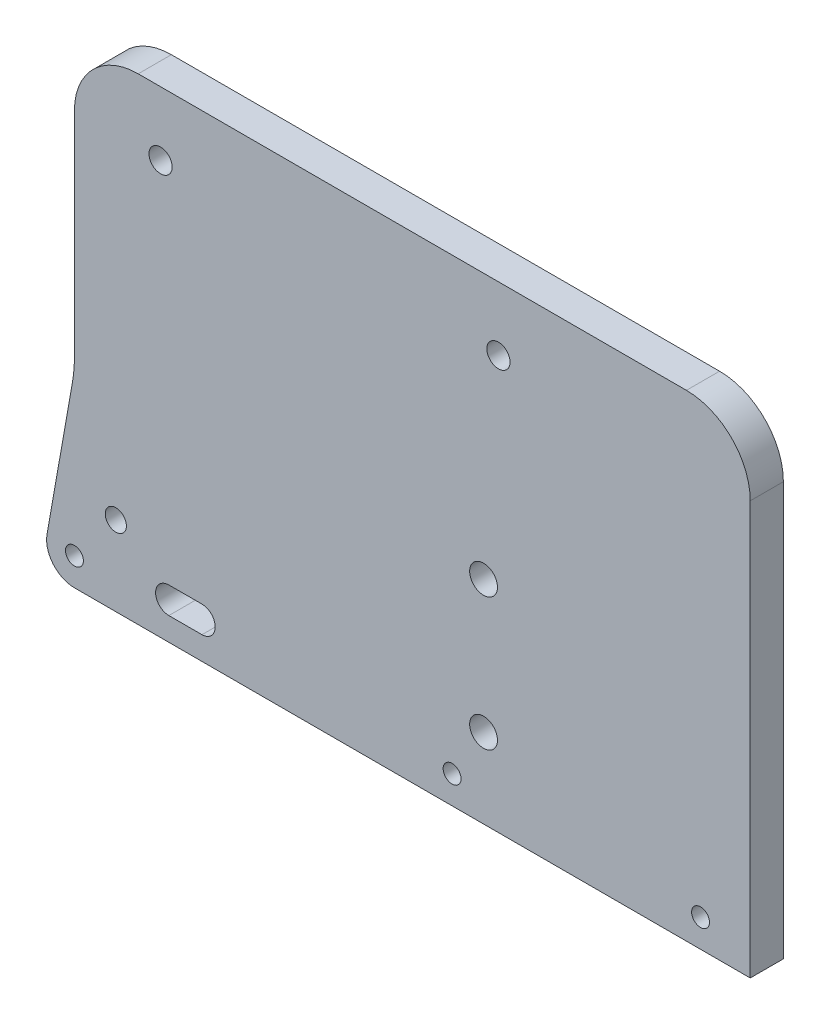
ISO-10303-21;
HEADER;
FILE_DESCRIPTION(('STEP AP214'),'2;1');
FILE_NAME('part.step','',(''),(''),'','','');
FILE_SCHEMA(('AUTOMOTIVE_DESIGN { 1 0 10303 214 1 1 1 1 }'));
ENDSEC;
DATA;
#1=APPLICATION_CONTEXT('core data for automotive mechanical design processes');
#2=APPLICATION_PROTOCOL_DEFINITION('international standard','automotive_design',2000,#1);
#3=PRODUCT_CONTEXT('',#1,'mechanical');
#4=PRODUCT('Part','Part','',(#3));
#5=PRODUCT_RELATED_PRODUCT_CATEGORY('part','',(#4));
#6=PRODUCT_DEFINITION_FORMATION('','',#4);
#7=PRODUCT_DEFINITION_CONTEXT('part definition',#1,'design');
#8=PRODUCT_DEFINITION('design','',#6,#7);
#9=PRODUCT_DEFINITION_SHAPE('','',#8);
#10=(LENGTH_UNIT() NAMED_UNIT(*) SI_UNIT(.MILLI.,.METRE.));
#11=(NAMED_UNIT(*) PLANE_ANGLE_UNIT() SI_UNIT($,.RADIAN.));
#12=(NAMED_UNIT(*) SI_UNIT($,.STERADIAN.) SOLID_ANGLE_UNIT());
#13=UNCERTAINTY_MEASURE_WITH_UNIT(LENGTH_MEASURE(1.E-05),#10,'distance_accuracy_value','');
#14=(GEOMETRIC_REPRESENTATION_CONTEXT(3) GLOBAL_UNCERTAINTY_ASSIGNED_CONTEXT((#13)) GLOBAL_UNIT_ASSIGNED_CONTEXT((#10,
#11,#12)) REPRESENTATION_CONTEXT('',''));
#15=CARTESIAN_POINT('',(0.,0.,0.));
#16=DIRECTION('',(0.,0.,1.));
#17=DIRECTION('',(1.,0.,0.));
#18=AXIS2_PLACEMENT_3D('',#15,#16,#17);
#19=CARTESIAN_POINT('',(30.62,50.37,5.));
#20=DIRECTION('',(0.,0.,1.));
#21=DIRECTION('',(1.,0.,0.));
#22=AXIS2_PLACEMENT_3D('',#19,#20,#21);
#23=PLANE('',#22);
#24=DIRECTION('',(1.,0.,0.));
#25=VECTOR('',#24,1.);
#26=CARTESIAN_POINT('',(-47.5,-8.5,5.));
#27=LINE('',#26,#25);
#28=CARTESIAN_POINT('',(-47.5,-8.5,5.));
#29=VERTEX_POINT('',#28);
#30=CARTESIAN_POINT('',(-42.5,-8.5,5.));
#31=VERTEX_POINT('',#30);
#32=EDGE_CURVE('E142',#29,#31,#27,.T.);
#33=ORIENTED_EDGE('',*,*,#32,.F.);
#34=CARTESIAN_POINT('',(-47.5,-6.5,5.));
#35=DIRECTION('',(0.,0.,1.));
#36=DIRECTION('',(1.,0.,0.));
#37=AXIS2_PLACEMENT_3D('',#34,#35,#36);
#38=CIRCLE('',#37,2.);
#39=CARTESIAN_POINT('',(-47.5,-4.5,5.));
#40=VERTEX_POINT('',#39);
#41=EDGE_CURVE('E134',#40,#29,#38,.T.);
#42=ORIENTED_EDGE('',*,*,#41,.F.);
#43=DIRECTION('',(-1.,0.,0.));
#44=VECTOR('',#43,1.);
#45=CARTESIAN_POINT('',(-47.5,-4.5,5.));
#46=LINE('',#45,#44);
#47=CARTESIAN_POINT('',(-42.5,-4.5,5.));
#48=VERTEX_POINT('',#47);
#49=EDGE_CURVE('E157',#48,#40,#46,.T.);
#50=ORIENTED_EDGE('',*,*,#49,.F.);
#51=CARTESIAN_POINT('',(-42.5,-6.5,5.));
#52=DIRECTION('',(0.,0.,1.));
#53=DIRECTION('',(1.,0.,0.));
#54=AXIS2_PLACEMENT_3D('',#51,#52,#53);
#55=CIRCLE('',#54,2.);
#56=EDGE_CURVE('E155',#31,#48,#55,.T.);
#57=ORIENTED_EDGE('',*,*,#56,.F.);
#58=EDGE_LOOP('',(#33,#42,#50,#57));
#59=FACE_BOUND('',#58,.T.);
#60=CARTESIAN_POINT('',(0.,20.,5.));
#61=DIRECTION('',(0.,0.,1.));
#62=DIRECTION('',(1.,0.,0.));
#63=AXIS2_PLACEMENT_3D('',#60,#61,#62);
#64=CIRCLE('',#63,2.1);
#65=CARTESIAN_POINT('',(2.1,20.,5.));
#66=VERTEX_POINT('',#65);
#67=EDGE_CURVE('E185',#66,#66,#64,.T.);
#68=ORIENTED_EDGE('',*,*,#67,.F.);
#69=EDGE_LOOP('',(#68));
#70=FACE_BOUND('',#69,.T.);
#71=CARTESIAN_POINT('',(-61.75,-7.8,5.));
#72=DIRECTION('',(0.,0.,1.));
#73=DIRECTION('',(1.,0.,0.));
#74=AXIS2_PLACEMENT_3D('',#71,#72,#73);
#75=CIRCLE('',#74,1.35);
#76=CARTESIAN_POINT('',(-60.4,-7.8,5.));
#77=VERTEX_POINT('',#76);
#78=EDGE_CURVE('E204',#77,#77,#75,.T.);
#79=ORIENTED_EDGE('',*,*,#78,.F.);
#80=EDGE_LOOP('',(#79));
#81=FACE_BOUND('',#80,.T.);
#82=CARTESIAN_POINT('',(2.25,50.37,5.));
#83=DIRECTION('',(0.,0.,1.));
#84=DIRECTION('',(-1.,0.,0.));
#85=AXIS2_PLACEMENT_3D('',#82,#83,#84);
#86=CIRCLE('',#85,1.75);
#87=CARTESIAN_POINT('',(0.499999999999995,50.37,5.));
#88=VERTEX_POINT('',#87);
#89=EDGE_CURVE('E220',#88,#88,#86,.T.);
#90=ORIENTED_EDGE('',*,*,#89,.F.);
#91=EDGE_LOOP('',(#90));
#92=FACE_BOUND('',#91,.T.);
#93=CARTESIAN_POINT('',(0.,0.,5.));
#94=DIRECTION('',(0.,0.,1.));
#95=DIRECTION('',(1.,0.,0.));
#96=AXIS2_PLACEMENT_3D('',#93,#94,#95);
#97=CIRCLE('',#96,2.1);
#98=CARTESIAN_POINT('',(2.1,0.,5.));
#99=VERTEX_POINT('',#98);
#100=EDGE_CURVE('E238',#99,#99,#97,.T.);
#101=ORIENTED_EDGE('',*,*,#100,.F.);
#102=EDGE_LOOP('',(#101));
#103=FACE_BOUND('',#102,.T.);
#104=CARTESIAN_POINT('',(30.62,50.37,5.));
#105=DIRECTION('',(0.,0.,1.));
#106=DIRECTION('',(1.,0.,0.));
#107=AXIS2_PLACEMENT_3D('',#104,#105,#106);
#108=CIRCLE('',#107,9.63);
#109=CARTESIAN_POINT('',(40.25,50.37,5.));
#110=VERTEX_POINT('',#109);
#111=CARTESIAN_POINT('',(30.62,60.,5.));
#112=VERTEX_POINT('',#111);
#113=EDGE_CURVE('E246',#110,#112,#108,.T.);
#114=ORIENTED_EDGE('',*,*,#113,.T.);
#115=DIRECTION('',(-1.,0.,0.));
#116=VECTOR('',#115,1.);
#117=CARTESIAN_POINT('',(-52.12,60.,5.));
#118=LINE('',#117,#116);
#119=CARTESIAN_POINT('',(-52.12,60.,5.));
#120=VERTEX_POINT('',#119);
#121=EDGE_CURVE('E388',#112,#120,#118,.T.);
#122=ORIENTED_EDGE('',*,*,#121,.T.);
#123=CARTESIAN_POINT('',(-52.12,50.37,5.));
#124=DIRECTION('',(0.,0.,1.));
#125=DIRECTION('',(1.,0.,0.));
#126=AXIS2_PLACEMENT_3D('',#123,#124,#125);
#127=CIRCLE('',#126,9.63);
#128=CARTESIAN_POINT('',(-61.75,50.37,5.));
#129=VERTEX_POINT('',#128);
#130=EDGE_CURVE('E320',#120,#129,#127,.T.);
#131=ORIENTED_EDGE('',*,*,#130,.T.);
#132=DIRECTION('',(0.,-1.,0.));
#133=VECTOR('',#132,1.);
#134=CARTESIAN_POINT('',(-61.75,18.1366092997226,5.));
#135=LINE('',#134,#133);
#136=CARTESIAN_POINT('',(-61.75,18.1366092997226,5.));
#137=VERTEX_POINT('',#136);
#138=EDGE_CURVE('E409',#129,#137,#135,.T.);
#139=ORIENTED_EDGE('',*,*,#138,.T.);
#140=CARTESIAN_POINT('',(-81.75,18.1366092997226,5.));
#141=DIRECTION('',(0.,0.,-1.));
#142=DIRECTION('',(1.,0.,0.));
#143=AXIS2_PLACEMENT_3D('',#140,#141,#142);
#144=CIRCLE('',#143,20.);
#145=CARTESIAN_POINT('',(-62.0538449397558,14.6636457463841,5.));
#146=VERTEX_POINT('',#145);
#147=EDGE_CURVE('E407',#137,#146,#144,.T.);
#148=ORIENTED_EDGE('',*,*,#147,.T.);
#149=DIRECTION('',(-0.173648177666923,-0.984807753012209,0.));
#150=VECTOR('',#149,1.);
#151=CARTESIAN_POINT('',(-62.0538449397558,14.6636457463841,5.));
#152=LINE('',#151,#150);
#153=CARTESIAN_POINT('',(-65.8861925626513,-7.07067765379892,5.));
#154=VERTEX_POINT('',#153);
#155=EDGE_CURVE('E405',#146,#154,#152,.T.);
#156=ORIENTED_EDGE('',*,*,#155,.T.);
#157=CARTESIAN_POINT('',(-61.75,-7.8,5.));
#158=DIRECTION('',(0.,0.,1.));
#159=DIRECTION('',(1.,0.,0.));
#160=AXIS2_PLACEMENT_3D('',#157,#158,#159);
#161=CIRCLE('',#160,4.2);
#162=CARTESIAN_POINT('',(-61.75,-12.,5.));
#163=VERTEX_POINT('',#162);
#164=EDGE_CURVE('E401',#154,#163,#161,.T.);
#165=ORIENTED_EDGE('',*,*,#164,.T.);
#166=DIRECTION('',(1.,0.,0.));
#167=VECTOR('',#166,1.);
#168=CARTESIAN_POINT('',(-61.75,-12.,5.));
#169=LINE('',#168,#167);
#170=CARTESIAN_POINT('',(40.25,-12.,5.));
#171=VERTEX_POINT('',#170);
#172=EDGE_CURVE('E398',#163,#171,#169,.T.);
#173=ORIENTED_EDGE('',*,*,#172,.T.);
#174=DIRECTION('',(0.,1.,0.));
#175=VECTOR('',#174,1.);
#176=CARTESIAN_POINT('',(40.25,-12.,5.));
#177=LINE('',#176,#175);
#178=EDGE_CURVE('E258',#171,#110,#177,.T.);
#179=ORIENTED_EDGE('',*,*,#178,.T.);
#180=EDGE_LOOP('',(#114,#122,#131,#139,#148,#156,#165,#173,#179));
#181=FACE_BOUND('',#180,.T.);
#182=CARTESIAN_POINT('',(-48.75,50.37,5.));
#183=DIRECTION('',(0.,0.,1.));
#184=DIRECTION('',(1.,0.,0.));
#185=AXIS2_PLACEMENT_3D('',#182,#183,#184);
#186=CIRCLE('',#185,1.75);
#187=CARTESIAN_POINT('',(-47.,50.37,5.));
#188=VERTEX_POINT('',#187);
#189=EDGE_CURVE('E230',#188,#188,#186,.T.);
#190=ORIENTED_EDGE('',*,*,#189,.F.);
#191=EDGE_LOOP('',(#190));
#192=FACE_BOUND('',#191,.T.);
#193=CARTESIAN_POINT('',(32.75,-7.8,5.));
#194=DIRECTION('',(0.,0.,1.));
#195=DIRECTION('',(1.,0.,0.));
#196=AXIS2_PLACEMENT_3D('',#193,#194,#195);
#197=CIRCLE('',#196,1.35);
#198=CARTESIAN_POINT('',(34.1,-7.8,5.));
#199=VERTEX_POINT('',#198);
#200=EDGE_CURVE('E212',#199,#199,#197,.T.);
#201=ORIENTED_EDGE('',*,*,#200,.F.);
#202=EDGE_LOOP('',(#201));
#203=FACE_BOUND('',#202,.T.);
#204=CARTESIAN_POINT('',(-4.75,-7.8,5.));
#205=DIRECTION('',(0.,0.,1.));
#206=DIRECTION('',(1.,0.,0.));
#207=AXIS2_PLACEMENT_3D('',#204,#205,#206);
#208=CIRCLE('',#207,1.35);
#209=CARTESIAN_POINT('',(-3.4,-7.8,5.));
#210=VERTEX_POINT('',#209);
#211=EDGE_CURVE('E193',#210,#210,#208,.T.);
#212=ORIENTED_EDGE('',*,*,#211,.F.);
#213=EDGE_LOOP('',(#212));
#214=FACE_BOUND('',#213,.T.);
#215=CARTESIAN_POINT('',(-55.5,0.,5.));
#216=DIRECTION('',(0.,0.,1.));
#217=DIRECTION('',(1.,0.,0.));
#218=AXIS2_PLACEMENT_3D('',#215,#216,#217);
#219=CIRCLE('',#218,1.6);
#220=CARTESIAN_POINT('',(-53.9,0.,5.));
#221=VERTEX_POINT('',#220);
#222=EDGE_CURVE('E164',#221,#221,#219,.T.);
#223=ORIENTED_EDGE('',*,*,#222,.F.);
#224=EDGE_LOOP('',(#223));
#225=FACE_BOUND('',#224,.T.);
#226=ADVANCED_FACE('F39',(#59,#70,#81,#92,#103,#181,#192,#203,#214,#225),#23,.T.);
#227=CARTESIAN_POINT('',(30.62,50.37,0.));
#228=DIRECTION('',(0.,0.,1.));
#229=DIRECTION('',(1.,0.,0.));
#230=AXIS2_PLACEMENT_3D('',#227,#228,#229);
#231=PLANE('',#230);
#232=CARTESIAN_POINT('',(0.,20.,0.));
#233=DIRECTION('',(0.,0.,1.));
#234=DIRECTION('',(1.,0.,0.));
#235=AXIS2_PLACEMENT_3D('',#232,#233,#234);
#236=CIRCLE('',#235,2.1);
#237=CARTESIAN_POINT('',(2.1,20.,0.));
#238=VERTEX_POINT('',#237);
#239=EDGE_CURVE('E150',#238,#238,#236,.T.);
#240=ORIENTED_EDGE('',*,*,#239,.T.);
#241=EDGE_LOOP('',(#240));
#242=FACE_BOUND('',#241,.T.);
#243=CARTESIAN_POINT('',(-4.75,-7.8,0.));
#244=DIRECTION('',(0.,0.,1.));
#245=DIRECTION('',(1.,0.,0.));
#246=AXIS2_PLACEMENT_3D('',#243,#244,#245);
#247=CIRCLE('',#246,1.35);
#248=CARTESIAN_POINT('',(-3.4,-7.8,0.));
#249=VERTEX_POINT('',#248);
#250=EDGE_CURVE('E188',#249,#249,#247,.T.);
#251=ORIENTED_EDGE('',*,*,#250,.T.);
#252=EDGE_LOOP('',(#251));
#253=FACE_BOUND('',#252,.T.);
#254=CARTESIAN_POINT('',(-61.75,-7.8,0.));
#255=DIRECTION('',(0.,0.,1.));
#256=DIRECTION('',(1.,0.,0.));
#257=AXIS2_PLACEMENT_3D('',#254,#255,#256);
#258=CIRCLE('',#257,1.35);
#259=CARTESIAN_POINT('',(-60.4,-7.8,0.));
#260=VERTEX_POINT('',#259);
#261=EDGE_CURVE('E207',#260,#260,#258,.T.);
#262=ORIENTED_EDGE('',*,*,#261,.T.);
#263=EDGE_LOOP('',(#262));
#264=FACE_BOUND('',#263,.T.);
#265=CARTESIAN_POINT('',(32.75,-7.8,0.));
#266=DIRECTION('',(0.,0.,1.));
#267=DIRECTION('',(1.,0.,0.));
#268=AXIS2_PLACEMENT_3D('',#265,#266,#267);
#269=CIRCLE('',#268,1.35);
#270=CARTESIAN_POINT('',(34.1,-7.8,0.));
#271=VERTEX_POINT('',#270);
#272=EDGE_CURVE('E206',#271,#271,#269,.T.);
#273=ORIENTED_EDGE('',*,*,#272,.T.);
#274=EDGE_LOOP('',(#273));
#275=FACE_BOUND('',#274,.T.);
#276=CARTESIAN_POINT('',(2.25,50.37,0.));
#277=DIRECTION('',(0.,0.,1.));
#278=DIRECTION('',(-1.,0.,0.));
#279=AXIS2_PLACEMENT_3D('',#276,#277,#278);
#280=CIRCLE('',#279,1.75);
#281=CARTESIAN_POINT('',(0.499999999999995,50.37,0.));
#282=VERTEX_POINT('',#281);
#283=EDGE_CURVE('E215',#282,#282,#280,.T.);
#284=ORIENTED_EDGE('',*,*,#283,.T.);
#285=EDGE_LOOP('',(#284));
#286=FACE_BOUND('',#285,.T.);
#287=CARTESIAN_POINT('',(-48.75,50.37,0.));
#288=DIRECTION('',(0.,0.,1.));
#289=DIRECTION('',(1.,0.,0.));
#290=AXIS2_PLACEMENT_3D('',#287,#288,#289);
#291=CIRCLE('',#290,1.75);
#292=CARTESIAN_POINT('',(-47.,50.37,0.));
#293=VERTEX_POINT('',#292);
#294=EDGE_CURVE('E233',#293,#293,#291,.T.);
#295=ORIENTED_EDGE('',*,*,#294,.T.);
#296=EDGE_LOOP('',(#295));
#297=FACE_BOUND('',#296,.T.);
#298=CARTESIAN_POINT('',(0.,0.,0.));
#299=DIRECTION('',(0.,0.,1.));
#300=DIRECTION('',(1.,0.,0.));
#301=AXIS2_PLACEMENT_3D('',#298,#299,#300);
#302=CIRCLE('',#301,2.1);
#303=CARTESIAN_POINT('',(2.1,0.,0.));
#304=VERTEX_POINT('',#303);
#305=EDGE_CURVE('E232',#304,#304,#302,.T.);
#306=ORIENTED_EDGE('',*,*,#305,.T.);
#307=EDGE_LOOP('',(#306));
#308=FACE_BOUND('',#307,.T.);
#309=CARTESIAN_POINT('',(30.62,50.37,0.));
#310=DIRECTION('',(0.,0.,1.));
#311=DIRECTION('',(1.,0.,0.));
#312=AXIS2_PLACEMENT_3D('',#309,#310,#311);
#313=CIRCLE('',#312,9.63);
#314=CARTESIAN_POINT('',(40.25,50.37,0.));
#315=VERTEX_POINT('',#314);
#316=CARTESIAN_POINT('',(30.62,60.,0.));
#317=VERTEX_POINT('',#316);
#318=EDGE_CURVE('E241',#315,#317,#313,.T.);
#319=ORIENTED_EDGE('',*,*,#318,.F.);
#320=DIRECTION('',(0.,1.,0.));
#321=VECTOR('',#320,1.);
#322=CARTESIAN_POINT('',(40.25,-12.,0.));
#323=LINE('',#322,#321);
#324=CARTESIAN_POINT('',(40.25,-12.,0.));
#325=VERTEX_POINT('',#324);
#326=EDGE_CURVE('E289',#325,#315,#323,.T.);
#327=ORIENTED_EDGE('',*,*,#326,.F.);
#328=DIRECTION('',(1.,0.,0.));
#329=VECTOR('',#328,1.);
#330=CARTESIAN_POINT('',(-61.75,-12.,0.));
#331=LINE('',#330,#329);
#332=CARTESIAN_POINT('',(-61.75,-12.,0.));
#333=VERTEX_POINT('',#332);
#334=EDGE_CURVE('E286',#333,#325,#331,.T.);
#335=ORIENTED_EDGE('',*,*,#334,.F.);
#336=CARTESIAN_POINT('',(-61.75,-7.8,0.));
#337=DIRECTION('',(0.,0.,1.));
#338=DIRECTION('',(1.,0.,0.));
#339=AXIS2_PLACEMENT_3D('',#336,#337,#338);
#340=CIRCLE('',#339,4.2);
#341=CARTESIAN_POINT('',(-65.8861925626513,-7.07067765379892,0.));
#342=VERTEX_POINT('',#341);
#343=EDGE_CURVE('E282',#342,#333,#340,.T.);
#344=ORIENTED_EDGE('',*,*,#343,.F.);
#345=DIRECTION('',(-0.173648177666923,-0.984807753012209,0.));
#346=VECTOR('',#345,1.);
#347=CARTESIAN_POINT('',(-62.0538449397558,14.6636457463841,0.));
#348=LINE('',#347,#346);
#349=CARTESIAN_POINT('',(-62.0538449397558,14.6636457463841,0.));
#350=VERTEX_POINT('',#349);
#351=EDGE_CURVE('E278',#350,#342,#348,.T.);
#352=ORIENTED_EDGE('',*,*,#351,.F.);
#353=CARTESIAN_POINT('',(-81.75,18.1366092997226,0.));
#354=DIRECTION('',(0.,0.,-1.));
#355=DIRECTION('',(1.,0.,0.));
#356=AXIS2_PLACEMENT_3D('',#353,#354,#355);
#357=CIRCLE('',#356,20.);
#358=CARTESIAN_POINT('',(-61.75,18.1366092997226,0.));
#359=VERTEX_POINT('',#358);
#360=EDGE_CURVE('E275',#359,#350,#357,.T.);
#361=ORIENTED_EDGE('',*,*,#360,.F.);
#362=DIRECTION('',(0.,-1.,0.));
#363=VECTOR('',#362,1.);
#364=CARTESIAN_POINT('',(-61.75,18.1366092997226,0.));
#365=LINE('',#364,#363);
#366=CARTESIAN_POINT('',(-61.75,50.37,0.));
#367=VERTEX_POINT('',#366);
#368=EDGE_CURVE('E267',#367,#359,#365,.T.);
#369=ORIENTED_EDGE('',*,*,#368,.F.);
#370=CARTESIAN_POINT('',(-52.12,50.37,0.));
#371=DIRECTION('',(0.,0.,1.));
#372=DIRECTION('',(1.,0.,0.));
#373=AXIS2_PLACEMENT_3D('',#370,#371,#372);
#374=CIRCLE('',#373,9.63);
#375=CARTESIAN_POINT('',(-52.12,60.,0.));
#376=VERTEX_POINT('',#375);
#377=EDGE_CURVE('E263',#376,#367,#374,.T.);
#378=ORIENTED_EDGE('',*,*,#377,.F.);
#379=DIRECTION('',(-1.,0.,0.));
#380=VECTOR('',#379,1.);
#381=CARTESIAN_POINT('',(-52.12,60.,0.));
#382=LINE('',#381,#380);
#383=EDGE_CURVE('E257',#317,#376,#382,.T.);
#384=ORIENTED_EDGE('',*,*,#383,.F.);
#385=EDGE_LOOP('',(#319,#327,#335,#344,#352,#361,#369,#378,#384));
#386=FACE_BOUND('',#385,.T.);
#387=CARTESIAN_POINT('',(-47.5,-6.5,0.));
#388=DIRECTION('',(0.,0.,1.));
#389=DIRECTION('',(1.,0.,0.));
#390=AXIS2_PLACEMENT_3D('',#387,#388,#389);
#391=CIRCLE('',#390,2.);
#392=CARTESIAN_POINT('',(-47.5,-4.5,0.));
#393=VERTEX_POINT('',#392);
#394=CARTESIAN_POINT('',(-47.5,-8.5,0.));
#395=VERTEX_POINT('',#394);
#396=EDGE_CURVE('E62',#393,#395,#391,.T.);
#397=ORIENTED_EDGE('',*,*,#396,.T.);
#398=DIRECTION('',(1.,0.,0.));
#399=VECTOR('',#398,1.);
#400=CARTESIAN_POINT('',(-47.5,-8.5,0.));
#401=LINE('',#400,#399);
#402=CARTESIAN_POINT('',(-42.5,-8.5,0.));
#403=VERTEX_POINT('',#402);
#404=EDGE_CURVE('E149',#395,#403,#401,.T.);
#405=ORIENTED_EDGE('',*,*,#404,.T.);
#406=CARTESIAN_POINT('',(-42.5,-6.5,0.));
#407=DIRECTION('',(0.,0.,1.));
#408=DIRECTION('',(1.,0.,0.));
#409=AXIS2_PLACEMENT_3D('',#406,#407,#408);
#410=CIRCLE('',#409,2.);
#411=CARTESIAN_POINT('',(-42.5,-4.5,0.));
#412=VERTEX_POINT('',#411);
#413=EDGE_CURVE('E174',#403,#412,#410,.T.);
#414=ORIENTED_EDGE('',*,*,#413,.T.);
#415=DIRECTION('',(-1.,0.,0.));
#416=VECTOR('',#415,1.);
#417=CARTESIAN_POINT('',(-47.5,-4.5,0.));
#418=LINE('',#417,#416);
#419=EDGE_CURVE('E143',#412,#393,#418,.T.);
#420=ORIENTED_EDGE('',*,*,#419,.T.);
#421=EDGE_LOOP('',(#397,#405,#414,#420));
#422=FACE_BOUND('',#421,.T.);
#423=CARTESIAN_POINT('',(-55.5,0.,0.));
#424=DIRECTION('',(0.,0.,1.));
#425=DIRECTION('',(1.,0.,0.));
#426=AXIS2_PLACEMENT_3D('',#423,#424,#425);
#427=CIRCLE('',#426,1.6);
#428=CARTESIAN_POINT('',(-53.9,0.,0.));
#429=VERTEX_POINT('',#428);
#430=EDGE_CURVE('E334',#429,#429,#427,.T.);
#431=ORIENTED_EDGE('',*,*,#430,.T.);
#432=EDGE_LOOP('',(#431));
#433=FACE_BOUND('',#432,.T.);
#434=ADVANCED_FACE('F325',(#242,#253,#264,#275,#286,#297,#308,#386,#422,#433),#231,.F.);
#435=CARTESIAN_POINT('',(30.62,50.37,5.));
#436=DIRECTION('',(0.,0.,-1.));
#437=DIRECTION('',(-1.,0.,0.));
#438=AXIS2_PLACEMENT_3D('',#435,#436,#437);
#439=CYLINDRICAL_SURFACE('',#438,9.63);
#440=ORIENTED_EDGE('',*,*,#318,.T.);
#441=DIRECTION('',(0.,0.,-1.));
#442=VECTOR('',#441,1.);
#443=CARTESIAN_POINT('',(30.62,60.,5.));
#444=LINE('',#443,#442);
#445=EDGE_CURVE('E12',#112,#317,#444,.T.);
#446=ORIENTED_EDGE('',*,*,#445,.F.);
#447=ORIENTED_EDGE('',*,*,#113,.F.);
#448=DIRECTION('',(0.,0.,-1.));
#449=VECTOR('',#448,1.);
#450=CARTESIAN_POINT('',(40.25,50.37,5.));
#451=LINE('',#450,#449);
#452=EDGE_CURVE('E293',#110,#315,#451,.T.);
#453=ORIENTED_EDGE('',*,*,#452,.T.);
#454=EDGE_LOOP('',(#440,#446,#447,#453));
#455=FACE_BOUND('',#454,.T.);
#456=ADVANCED_FACE('F41',(#455),#439,.T.);
#457=CARTESIAN_POINT('',(-52.12,60.,5.));
#458=DIRECTION('',(0.,-1.,0.));
#459=DIRECTION('',(0.,0.,-1.));
#460=AXIS2_PLACEMENT_3D('',#457,#458,#459);
#461=PLANE('',#460);
#462=ORIENTED_EDGE('',*,*,#383,.T.);
#463=DIRECTION('',(0.,0.,-1.));
#464=VECTOR('',#463,1.);
#465=CARTESIAN_POINT('',(-52.12,60.,5.));
#466=LINE('',#465,#464);
#467=EDGE_CURVE('E47',#120,#376,#466,.T.);
#468=ORIENTED_EDGE('',*,*,#467,.F.);
#469=ORIENTED_EDGE('',*,*,#121,.F.);
#470=ORIENTED_EDGE('',*,*,#445,.T.);
#471=EDGE_LOOP('',(#462,#468,#469,#470));
#472=FACE_BOUND('',#471,.T.);
#473=ADVANCED_FACE('F381',(#472),#461,.F.);
#474=CARTESIAN_POINT('',(-52.12,50.37,5.));
#475=DIRECTION('',(0.,0.,-1.));
#476=DIRECTION('',(-1.,0.,0.));
#477=AXIS2_PLACEMENT_3D('',#474,#475,#476);
#478=CYLINDRICAL_SURFACE('',#477,9.63);
#479=ORIENTED_EDGE('',*,*,#377,.T.);
#480=DIRECTION('',(0.,0.,-1.));
#481=VECTOR('',#480,1.);
#482=CARTESIAN_POINT('',(-61.75,50.37,5.));
#483=LINE('',#482,#481);
#484=EDGE_CURVE('E311',#129,#367,#483,.T.);
#485=ORIENTED_EDGE('',*,*,#484,.F.);
#486=ORIENTED_EDGE('',*,*,#130,.F.);
#487=ORIENTED_EDGE('',*,*,#467,.T.);
#488=EDGE_LOOP('',(#479,#485,#486,#487));
#489=FACE_BOUND('',#488,.T.);
#490=ADVANCED_FACE('F318',(#489),#478,.T.);
#491=CARTESIAN_POINT('',(-61.75,18.1366092997226,5.));
#492=DIRECTION('',(1.,0.,0.));
#493=DIRECTION('',(0.,1.,0.));
#494=AXIS2_PLACEMENT_3D('',#491,#492,#493);
#495=PLANE('',#494);
#496=ORIENTED_EDGE('',*,*,#368,.T.);
#497=DIRECTION('',(0.,0.,-1.));
#498=VECTOR('',#497,1.);
#499=CARTESIAN_POINT('',(-61.75,18.1366092997226,5.));
#500=LINE('',#499,#498);
#501=EDGE_CURVE('E308',#137,#359,#500,.T.);
#502=ORIENTED_EDGE('',*,*,#501,.F.);
#503=ORIENTED_EDGE('',*,*,#138,.F.);
#504=ORIENTED_EDGE('',*,*,#484,.T.);
#505=EDGE_LOOP('',(#496,#502,#503,#504));
#506=FACE_BOUND('',#505,.T.);
#507=ADVANCED_FACE('F376',(#506),#495,.F.);
#508=CARTESIAN_POINT('',(-81.75,18.1366092997226,5.));
#509=DIRECTION('',(0.,0.,-1.));
#510=DIRECTION('',(-1.,0.,0.));
#511=AXIS2_PLACEMENT_3D('',#508,#509,#510);
#512=CYLINDRICAL_SURFACE('',#511,20.);
#513=ORIENTED_EDGE('',*,*,#360,.T.);
#514=DIRECTION('',(0.,0.,-1.));
#515=VECTOR('',#514,1.);
#516=CARTESIAN_POINT('',(-62.0538449397558,14.6636457463841,5.));
#517=LINE('',#516,#515);
#518=EDGE_CURVE('E305',#146,#350,#517,.T.);
#519=ORIENTED_EDGE('',*,*,#518,.F.);
#520=ORIENTED_EDGE('',*,*,#147,.F.);
#521=ORIENTED_EDGE('',*,*,#501,.T.);
#522=EDGE_LOOP('',(#513,#519,#520,#521));
#523=FACE_BOUND('',#522,.T.);
#524=ADVANCED_FACE('F372',(#523),#512,.F.);
#525=CARTESIAN_POINT('',(-62.0538449397558,14.6636457463841,5.));
#526=DIRECTION('',(0.984807753012209,-0.173648177666923,0.));
#527=DIRECTION('',(0.173648177666923,0.984807753012209,0.));
#528=AXIS2_PLACEMENT_3D('',#525,#526,#527);
#529=PLANE('',#528);
#530=ORIENTED_EDGE('',*,*,#351,.T.);
#531=DIRECTION('',(0.,0.,-1.));
#532=VECTOR('',#531,1.);
#533=CARTESIAN_POINT('',(-65.8861925626513,-7.07067765379892,5.));
#534=LINE('',#533,#532);
#535=EDGE_CURVE('E302',#154,#342,#534,.T.);
#536=ORIENTED_EDGE('',*,*,#535,.F.);
#537=ORIENTED_EDGE('',*,*,#155,.F.);
#538=ORIENTED_EDGE('',*,*,#518,.T.);
#539=EDGE_LOOP('',(#530,#536,#537,#538));
#540=FACE_BOUND('',#539,.T.);
#541=ADVANCED_FACE('F368',(#540),#529,.F.);
#542=CARTESIAN_POINT('',(-61.75,-7.8,5.));
#543=DIRECTION('',(0.,0.,-1.));
#544=DIRECTION('',(-1.,0.,0.));
#545=AXIS2_PLACEMENT_3D('',#542,#543,#544);
#546=CYLINDRICAL_SURFACE('',#545,4.2);
#547=ORIENTED_EDGE('',*,*,#343,.T.);
#548=DIRECTION('',(0.,0.,-1.));
#549=VECTOR('',#548,1.);
#550=CARTESIAN_POINT('',(-61.75,-12.,5.));
#551=LINE('',#550,#549);
#552=EDGE_CURVE('E299',#163,#333,#551,.T.);
#553=ORIENTED_EDGE('',*,*,#552,.F.);
#554=ORIENTED_EDGE('',*,*,#164,.F.);
#555=ORIENTED_EDGE('',*,*,#535,.T.);
#556=EDGE_LOOP('',(#547,#553,#554,#555));
#557=FACE_BOUND('',#556,.T.);
#558=ADVANCED_FACE('F364',(#557),#546,.T.);
#559=CARTESIAN_POINT('',(-61.75,-12.,5.));
#560=DIRECTION('',(0.,1.,0.));
#561=DIRECTION('',(0.,0.,1.));
#562=AXIS2_PLACEMENT_3D('',#559,#560,#561);
#563=PLANE('',#562);
#564=ORIENTED_EDGE('',*,*,#334,.T.);
#565=DIRECTION('',(0.,0.,-1.));
#566=VECTOR('',#565,1.);
#567=CARTESIAN_POINT('',(40.25,-12.,5.));
#568=LINE('',#567,#566);
#569=EDGE_CURVE('E296',#171,#325,#568,.T.);
#570=ORIENTED_EDGE('',*,*,#569,.F.);
#571=ORIENTED_EDGE('',*,*,#172,.F.);
#572=ORIENTED_EDGE('',*,*,#552,.T.);
#573=EDGE_LOOP('',(#564,#570,#571,#572));
#574=FACE_BOUND('',#573,.T.);
#575=ADVANCED_FACE('F360',(#574),#563,.F.);
#576=CARTESIAN_POINT('',(40.25,-12.,5.));
#577=DIRECTION('',(-1.,0.,0.));
#578=DIRECTION('',(0.,0.,1.));
#579=AXIS2_PLACEMENT_3D('',#576,#577,#578);
#580=PLANE('',#579);
#581=ORIENTED_EDGE('',*,*,#326,.T.);
#582=ORIENTED_EDGE('',*,*,#452,.F.);
#583=ORIENTED_EDGE('',*,*,#178,.F.);
#584=ORIENTED_EDGE('',*,*,#569,.T.);
#585=EDGE_LOOP('',(#581,#582,#583,#584));
#586=FACE_BOUND('',#585,.T.);
#587=ADVANCED_FACE('F357',(#586),#580,.F.);
#588=CARTESIAN_POINT('',(0.,0.,5.));
#589=DIRECTION('',(0.,0.,-1.));
#590=DIRECTION('',(-1.,0.,0.));
#591=AXIS2_PLACEMENT_3D('',#588,#589,#590);
#592=CYLINDRICAL_SURFACE('',#591,2.1);
#593=ORIENTED_EDGE('',*,*,#100,.T.);
#594=EDGE_LOOP('',(#593));
#595=FACE_BOUND('',#594,.T.);
#596=ORIENTED_EDGE('',*,*,#305,.F.);
#597=EDGE_LOOP('',(#596));
#598=FACE_BOUND('',#597,.T.);
#599=ADVANCED_FACE('F354',(#595,#598),#592,.F.);
#600=CARTESIAN_POINT('',(-48.75,50.37,5.));
#601=DIRECTION('',(0.,0.,-1.));
#602=DIRECTION('',(-1.,0.,0.));
#603=AXIS2_PLACEMENT_3D('',#600,#601,#602);
#604=CYLINDRICAL_SURFACE('',#603,1.75);
#605=ORIENTED_EDGE('',*,*,#189,.T.);
#606=EDGE_LOOP('',(#605));
#607=FACE_BOUND('',#606,.T.);
#608=ORIENTED_EDGE('',*,*,#294,.F.);
#609=EDGE_LOOP('',(#608));
#610=FACE_BOUND('',#609,.T.);
#611=ADVANCED_FACE('F444',(#607,#610),#604,.F.);
#612=CARTESIAN_POINT('',(2.25,50.37,5.));
#613=DIRECTION('',(0.,0.,-1.));
#614=DIRECTION('',(-1.,0.,0.));
#615=AXIS2_PLACEMENT_3D('',#612,#613,#614);
#616=CYLINDRICAL_SURFACE('',#615,1.75);
#617=ORIENTED_EDGE('',*,*,#89,.T.);
#618=EDGE_LOOP('',(#617));
#619=FACE_BOUND('',#618,.T.);
#620=ORIENTED_EDGE('',*,*,#283,.F.);
#621=EDGE_LOOP('',(#620));
#622=FACE_BOUND('',#621,.T.);
#623=ADVANCED_FACE('F449',(#619,#622),#616,.F.);
#624=CARTESIAN_POINT('',(32.75,-7.8,5.));
#625=DIRECTION('',(0.,0.,-1.));
#626=DIRECTION('',(-1.,0.,0.));
#627=AXIS2_PLACEMENT_3D('',#624,#625,#626);
#628=CYLINDRICAL_SURFACE('',#627,1.35);
#629=ORIENTED_EDGE('',*,*,#200,.T.);
#630=EDGE_LOOP('',(#629));
#631=FACE_BOUND('',#630,.T.);
#632=ORIENTED_EDGE('',*,*,#272,.F.);
#633=EDGE_LOOP('',(#632));
#634=FACE_BOUND('',#633,.T.);
#635=ADVANCED_FACE('F456',(#631,#634),#628,.F.);
#636=CARTESIAN_POINT('',(-61.75,-7.8,5.));
#637=DIRECTION('',(0.,0.,-1.));
#638=DIRECTION('',(-1.,0.,0.));
#639=AXIS2_PLACEMENT_3D('',#636,#637,#638);
#640=CYLINDRICAL_SURFACE('',#639,1.35);
#641=ORIENTED_EDGE('',*,*,#78,.T.);
#642=EDGE_LOOP('',(#641));
#643=FACE_BOUND('',#642,.T.);
#644=ORIENTED_EDGE('',*,*,#261,.F.);
#645=EDGE_LOOP('',(#644));
#646=FACE_BOUND('',#645,.T.);
#647=ADVANCED_FACE('F428',(#643,#646),#640,.F.);
#648=CARTESIAN_POINT('',(-4.75,-7.8,5.));
#649=DIRECTION('',(0.,0.,-1.));
#650=DIRECTION('',(-1.,0.,0.));
#651=AXIS2_PLACEMENT_3D('',#648,#649,#650);
#652=CYLINDRICAL_SURFACE('',#651,1.35);
#653=ORIENTED_EDGE('',*,*,#211,.T.);
#654=EDGE_LOOP('',(#653));
#655=FACE_BOUND('',#654,.T.);
#656=ORIENTED_EDGE('',*,*,#250,.F.);
#657=EDGE_LOOP('',(#656));
#658=FACE_BOUND('',#657,.T.);
#659=ADVANCED_FACE('F424',(#655,#658),#652,.F.);
#660=CARTESIAN_POINT('',(0.,20.,5.));
#661=DIRECTION('',(0.,0.,-1.));
#662=DIRECTION('',(-1.,0.,0.));
#663=AXIS2_PLACEMENT_3D('',#660,#661,#662);
#664=CYLINDRICAL_SURFACE('',#663,2.1);
#665=ORIENTED_EDGE('',*,*,#67,.T.);
#666=EDGE_LOOP('',(#665));
#667=FACE_BOUND('',#666,.T.);
#668=ORIENTED_EDGE('',*,*,#239,.F.);
#669=EDGE_LOOP('',(#668));
#670=FACE_BOUND('',#669,.T.);
#671=ADVANCED_FACE('F427',(#667,#670),#664,.F.);
#672=CARTESIAN_POINT('',(-47.5,-6.5,5.));
#673=DIRECTION('',(0.,0.,-1.));
#674=DIRECTION('',(-1.,0.,0.));
#675=AXIS2_PLACEMENT_3D('',#672,#673,#674);
#676=CYLINDRICAL_SURFACE('',#675,2.);
#677=ORIENTED_EDGE('',*,*,#396,.F.);
#678=DIRECTION('',(0.,0.,-1.));
#679=VECTOR('',#678,1.);
#680=CARTESIAN_POINT('',(-47.5,-4.5,5.));
#681=LINE('',#680,#679);
#682=EDGE_CURVE('E138',#40,#393,#681,.T.);
#683=ORIENTED_EDGE('',*,*,#682,.F.);
#684=ORIENTED_EDGE('',*,*,#41,.T.);
#685=DIRECTION('',(0.,0.,-1.));
#686=VECTOR('',#685,1.);
#687=CARTESIAN_POINT('',(-47.5,-8.5,5.));
#688=LINE('',#687,#686);
#689=EDGE_CURVE('E137',#29,#395,#688,.T.);
#690=ORIENTED_EDGE('',*,*,#689,.T.);
#691=EDGE_LOOP('',(#677,#683,#684,#690));
#692=FACE_BOUND('',#691,.T.);
#693=ADVANCED_FACE('F136',(#692),#676,.F.);
#694=CARTESIAN_POINT('',(-47.5,-8.5,5.));
#695=DIRECTION('',(0.,1.,0.));
#696=DIRECTION('',(0.,0.,1.));
#697=AXIS2_PLACEMENT_3D('',#694,#695,#696);
#698=PLANE('',#697);
#699=ORIENTED_EDGE('',*,*,#404,.F.);
#700=ORIENTED_EDGE('',*,*,#689,.F.);
#701=ORIENTED_EDGE('',*,*,#32,.T.);
#702=DIRECTION('',(0.,0.,-1.));
#703=VECTOR('',#702,1.);
#704=CARTESIAN_POINT('',(-42.5,-8.5,5.));
#705=LINE('',#704,#703);
#706=EDGE_CURVE('E151',#31,#403,#705,.T.);
#707=ORIENTED_EDGE('',*,*,#706,.T.);
#708=EDGE_LOOP('',(#699,#700,#701,#707));
#709=FACE_BOUND('',#708,.T.);
#710=ADVANCED_FACE('F146',(#709),#698,.T.);
#711=CARTESIAN_POINT('',(-42.5,-6.5,5.));
#712=DIRECTION('',(0.,0.,-1.));
#713=DIRECTION('',(-1.,0.,0.));
#714=AXIS2_PLACEMENT_3D('',#711,#712,#713);
#715=CYLINDRICAL_SURFACE('',#714,2.);
#716=ORIENTED_EDGE('',*,*,#413,.F.);
#717=ORIENTED_EDGE('',*,*,#706,.F.);
#718=ORIENTED_EDGE('',*,*,#56,.T.);
#719=DIRECTION('',(0.,0.,-1.));
#720=VECTOR('',#719,1.);
#721=CARTESIAN_POINT('',(-42.5,-4.5,5.));
#722=LINE('',#721,#720);
#723=EDGE_CURVE('E54',#48,#412,#722,.T.);
#724=ORIENTED_EDGE('',*,*,#723,.T.);
#725=EDGE_LOOP('',(#716,#717,#718,#724));
#726=FACE_BOUND('',#725,.T.);
#727=ADVANCED_FACE('F474',(#726),#715,.F.);
#728=CARTESIAN_POINT('',(-47.5,-4.5,5.));
#729=DIRECTION('',(0.,-1.,0.));
#730=DIRECTION('',(1.,0.,0.));
#731=AXIS2_PLACEMENT_3D('',#728,#729,#730);
#732=PLANE('',#731);
#733=ORIENTED_EDGE('',*,*,#419,.F.);
#734=ORIENTED_EDGE('',*,*,#723,.F.);
#735=ORIENTED_EDGE('',*,*,#49,.T.);
#736=ORIENTED_EDGE('',*,*,#682,.T.);
#737=EDGE_LOOP('',(#733,#734,#735,#736));
#738=FACE_BOUND('',#737,.T.);
#739=ADVANCED_FACE('F477',(#738),#732,.T.);
#740=CARTESIAN_POINT('',(-55.5,0.,5.));
#741=DIRECTION('',(0.,0.,-1.));
#742=DIRECTION('',(-1.,0.,0.));
#743=AXIS2_PLACEMENT_3D('',#740,#741,#742);
#744=CYLINDRICAL_SURFACE('',#743,1.6);
#745=ORIENTED_EDGE('',*,*,#222,.T.);
#746=EDGE_LOOP('',(#745));
#747=FACE_BOUND('',#746,.T.);
#748=ORIENTED_EDGE('',*,*,#430,.F.);
#749=EDGE_LOOP('',(#748));
#750=FACE_BOUND('',#749,.T.);
#751=ADVANCED_FACE('F343',(#747,#750),#744,.F.);
#752=CLOSED_SHELL('',(#226,#434,#456,#473,#490,#507,#524,#541,#558,#575,#587,#599,#611,#623,
#635,#647,#659,#671,#693,#710,#727,#739,#751));
#753=MANIFOLD_SOLID_BREP('B2',#752);
#754=ADVANCED_BREP_SHAPE_REPRESENTATION('',(#18,#753),#14);
#755=SHAPE_DEFINITION_REPRESENTATION(#9,#754);
ENDSEC;
END-ISO-10303-21;
